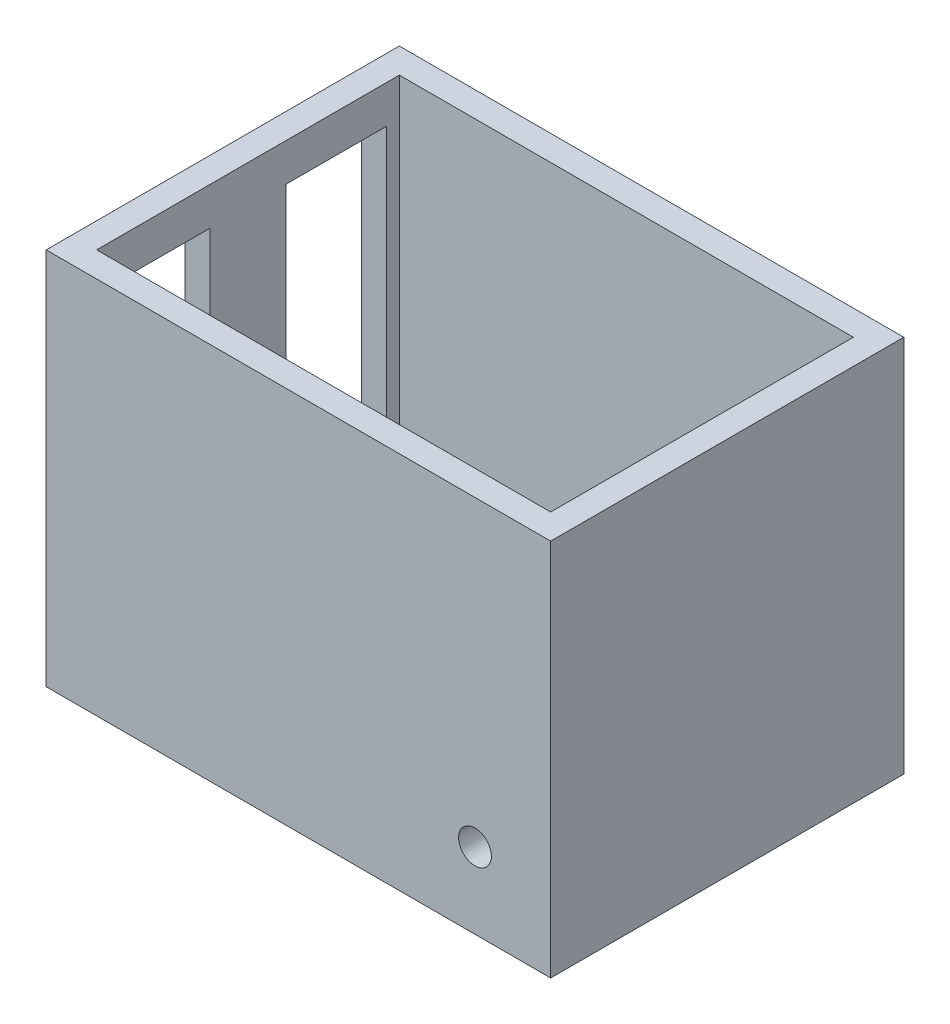
ISO-10303-21;
HEADER;
FILE_DESCRIPTION(('STEP AP214'),'2;1');
FILE_NAME('part.step','',(''),(''),'','','');
FILE_SCHEMA(('AUTOMOTIVE_DESIGN { 1 0 10303 214 1 1 1 1 }'));
ENDSEC;
DATA;
#1=APPLICATION_CONTEXT('core data for automotive mechanical design processes');
#2=APPLICATION_PROTOCOL_DEFINITION('international standard','automotive_design',2000,#1);
#3=PRODUCT_CONTEXT('',#1,'mechanical');
#4=PRODUCT('Part','Part','',(#3));
#5=PRODUCT_RELATED_PRODUCT_CATEGORY('part','',(#4));
#6=PRODUCT_DEFINITION_FORMATION('','',#4);
#7=PRODUCT_DEFINITION_CONTEXT('part definition',#1,'design');
#8=PRODUCT_DEFINITION('design','',#6,#7);
#9=PRODUCT_DEFINITION_SHAPE('','',#8);
#10=(LENGTH_UNIT() NAMED_UNIT(*) SI_UNIT(.MILLI.,.METRE.));
#11=(NAMED_UNIT(*) PLANE_ANGLE_UNIT() SI_UNIT($,.RADIAN.));
#12=(NAMED_UNIT(*) SI_UNIT($,.STERADIAN.) SOLID_ANGLE_UNIT());
#13=UNCERTAINTY_MEASURE_WITH_UNIT(LENGTH_MEASURE(1.E-05),#10,'distance_accuracy_value','');
#14=(GEOMETRIC_REPRESENTATION_CONTEXT(3) GLOBAL_UNCERTAINTY_ASSIGNED_CONTEXT((#13)) GLOBAL_UNIT_ASSIGNED_CONTEXT((#10,
#11,#12)) REPRESENTATION_CONTEXT('',''));
#15=CARTESIAN_POINT('',(0.,0.,0.));
#16=DIRECTION('',(0.,0.,1.));
#17=DIRECTION('',(1.,0.,0.));
#18=AXIS2_PLACEMENT_3D('',#15,#16,#17);
#19=CARTESIAN_POINT('',(-44.7075141862719,76.2,-29.2129134118241));
#20=DIRECTION('',(1.,0.,0.));
#21=DIRECTION('',(0.,0.,-1.));
#22=AXIS2_PLACEMENT_3D('',#19,#20,#21);
#23=PLANE('',#22);
#24=DIRECTION('',(0.,0.,1.));
#25=VECTOR('',#24,1.);
#26=CARTESIAN_POINT('',(-44.7075141862719,7.62,13.9670865881758));
#27=LINE('',#26,#25);
#28=CARTESIAN_POINT('',(-44.7075141862719,7.62000000000002,13.9670865881758));
#29=VERTEX_POINT('',#28);
#30=CARTESIAN_POINT('',(-44.7075141862719,7.62,34.2870865881758));
#31=VERTEX_POINT('',#30);
#32=EDGE_CURVE('E157',#29,#31,#27,.T.);
#33=ORIENTED_EDGE('',*,*,#32,.F.);
#34=DIRECTION('',(0.,-1.,0.));
#35=VECTOR('',#34,1.);
#36=CARTESIAN_POINT('',(-44.7075141862719,68.58,13.9670865881758));
#37=LINE('',#36,#35);
#38=CARTESIAN_POINT('',(-44.7075141862719,68.58,13.9670865881758));
#39=VERTEX_POINT('',#38);
#40=EDGE_CURVE('E47',#39,#29,#37,.T.);
#41=ORIENTED_EDGE('',*,*,#40,.F.);
#42=DIRECTION('',(0.,0.,-1.));
#43=VECTOR('',#42,1.);
#44=CARTESIAN_POINT('',(-44.7075141862719,68.58,13.9670865881758));
#45=LINE('',#44,#43);
#46=CARTESIAN_POINT('',(-44.7075141862719,68.58,34.2870865881758));
#47=VERTEX_POINT('',#46);
#48=EDGE_CURVE('E163',#47,#39,#45,.T.);
#49=ORIENTED_EDGE('',*,*,#48,.F.);
#50=DIRECTION('',(0.,1.,0.));
#51=VECTOR('',#50,1.);
#52=CARTESIAN_POINT('',(-44.7075141862719,68.58,34.2870865881758));
#53=LINE('',#52,#51);
#54=EDGE_CURVE('E148',#31,#47,#53,.T.);
#55=ORIENTED_EDGE('',*,*,#54,.F.);
#56=EDGE_LOOP('',(#33,#41,#49,#55));
#57=FACE_BOUND('',#56,.T.);
#58=DIRECTION('',(0.,0.,1.));
#59=VECTOR('',#58,1.);
#60=CARTESIAN_POINT('',(-44.7075141862719,7.62,-21.5929134118241));
#61=LINE('',#60,#59);
#62=CARTESIAN_POINT('',(-44.7075141862719,7.62000000000002,-21.5929134118241));
#63=VERTEX_POINT('',#62);
#64=CARTESIAN_POINT('',(-44.7075141862719,7.62,-1.27291341182414));
#65=VERTEX_POINT('',#64);
#66=EDGE_CURVE('E174',#63,#65,#61,.T.);
#67=ORIENTED_EDGE('',*,*,#66,.F.);
#68=DIRECTION('',(0.,-1.,0.));
#69=VECTOR('',#68,1.);
#70=CARTESIAN_POINT('',(-44.7075141862719,68.58,-21.5929134118241));
#71=LINE('',#70,#69);
#72=CARTESIAN_POINT('',(-44.7075141862719,68.58,-21.5929134118241));
#73=VERTEX_POINT('',#72);
#74=EDGE_CURVE('E170',#73,#63,#71,.T.);
#75=ORIENTED_EDGE('',*,*,#74,.F.);
#76=DIRECTION('',(0.,0.,-1.));
#77=VECTOR('',#76,1.);
#78=CARTESIAN_POINT('',(-44.7075141862719,68.58,-21.5929134118241));
#79=LINE('',#78,#77);
#80=CARTESIAN_POINT('',(-44.7075141862719,68.58,-1.27291341182415));
#81=VERTEX_POINT('',#80);
#82=EDGE_CURVE('E180',#81,#73,#79,.T.);
#83=ORIENTED_EDGE('',*,*,#82,.F.);
#84=DIRECTION('',(0.,1.,0.));
#85=VECTOR('',#84,1.);
#86=CARTESIAN_POINT('',(-44.7075141862719,68.58,-1.27291341182415));
#87=LINE('',#86,#85);
#88=EDGE_CURVE('E177',#65,#81,#87,.T.);
#89=ORIENTED_EDGE('',*,*,#88,.F.);
#90=EDGE_LOOP('',(#67,#75,#83,#89));
#91=FACE_BOUND('',#90,.T.);
#92=DIRECTION('',(0.,0.,1.));
#93=VECTOR('',#92,1.);
#94=CARTESIAN_POINT('',(-44.7075141862719,0.,-29.2129134118241));
#95=LINE('',#94,#93);
#96=CARTESIAN_POINT('',(-44.7075141862719,0.,-29.2129134118241));
#97=VERTEX_POINT('',#96);
#98=CARTESIAN_POINT('',(-44.7075141862719,0.,41.9070865881758));
#99=VERTEX_POINT('',#98);
#100=EDGE_CURVE('E232',#97,#99,#95,.T.);
#101=ORIENTED_EDGE('',*,*,#100,.T.);
#102=DIRECTION('',(0.,-1.,0.));
#103=VECTOR('',#102,1.);
#104=CARTESIAN_POINT('',(-44.7075141862719,76.2,41.9070865881758));
#105=LINE('',#104,#103);
#106=CARTESIAN_POINT('',(-44.7075141862719,76.2,41.9070865881758));
#107=VERTEX_POINT('',#106);
#108=EDGE_CURVE('E265',#107,#99,#105,.T.);
#109=ORIENTED_EDGE('',*,*,#108,.F.);
#110=DIRECTION('',(0.,0.,1.));
#111=VECTOR('',#110,1.);
#112=CARTESIAN_POINT('',(-44.7075141862719,76.2,-29.2129134118241));
#113=LINE('',#112,#111);
#114=CARTESIAN_POINT('',(-44.7075141862719,76.2,-29.2129134118241));
#115=VERTEX_POINT('',#114);
#116=EDGE_CURVE('E239',#115,#107,#113,.T.);
#117=ORIENTED_EDGE('',*,*,#116,.F.);
#118=DIRECTION('',(0.,-1.,0.));
#119=VECTOR('',#118,1.);
#120=CARTESIAN_POINT('',(-44.7075141862719,76.2,-29.2129134118241));
#121=LINE('',#120,#119);
#122=EDGE_CURVE('E249',#115,#97,#121,.T.);
#123=ORIENTED_EDGE('',*,*,#122,.T.);
#124=EDGE_LOOP('',(#101,#109,#117,#123));
#125=FACE_BOUND('',#124,.T.);
#126=ADVANCED_FACE('F33',(#57,#91,#125),#23,.F.);
#127=CARTESIAN_POINT('',(-44.7075141862719,76.2,41.9070865881758));
#128=DIRECTION('',(0.,0.,-1.));
#129=DIRECTION('',(-1.,0.,0.));
#130=AXIS2_PLACEMENT_3D('',#127,#128,#129);
#131=PLANE('',#130);
#132=CARTESIAN_POINT('',(41.6524858137281,15.24,41.9070865881758));
#133=DIRECTION('',(0.,0.,1.));
#134=DIRECTION('',(1.,0.,0.));
#135=AXIS2_PLACEMENT_3D('',#132,#133,#134);
#136=CIRCLE('',#135,3.302);
#137=CARTESIAN_POINT('',(44.9544858137281,15.24,41.9070865881758));
#138=VERTEX_POINT('',#137);
#139=EDGE_CURVE('E204',#138,#138,#136,.T.);
#140=ORIENTED_EDGE('',*,*,#139,.F.);
#141=EDGE_LOOP('',(#140));
#142=FACE_BOUND('',#141,.T.);
#143=DIRECTION('',(1.,0.,0.));
#144=VECTOR('',#143,1.);
#145=CARTESIAN_POINT('',(-44.7075141862719,0.,41.9070865881758));
#146=LINE('',#145,#144);
#147=CARTESIAN_POINT('',(56.8924858137281,0.,41.9070865881758));
#148=VERTEX_POINT('',#147);
#149=EDGE_CURVE('E252',#99,#148,#146,.T.);
#150=ORIENTED_EDGE('',*,*,#149,.T.);
#151=DIRECTION('',(0.,-1.,0.));
#152=VECTOR('',#151,1.);
#153=CARTESIAN_POINT('',(56.8924858137281,76.2,41.9070865881758));
#154=LINE('',#153,#152);
#155=CARTESIAN_POINT('',(56.8924858137281,76.2,41.9070865881758));
#156=VERTEX_POINT('',#155);
#157=EDGE_CURVE('E262',#156,#148,#154,.T.);
#158=ORIENTED_EDGE('',*,*,#157,.F.);
#159=DIRECTION('',(1.,0.,0.));
#160=VECTOR('',#159,1.);
#161=CARTESIAN_POINT('',(-44.7075141862719,76.2,41.9070865881758));
#162=LINE('',#161,#160);
#163=EDGE_CURVE('E242',#107,#156,#162,.T.);
#164=ORIENTED_EDGE('',*,*,#163,.F.);
#165=ORIENTED_EDGE('',*,*,#108,.T.);
#166=EDGE_LOOP('',(#150,#158,#164,#165));
#167=FACE_BOUND('',#166,.T.);
#168=ADVANCED_FACE('F306',(#142,#167),#131,.F.);
#169=CARTESIAN_POINT('',(56.8924858137281,76.2,-29.2129134118241));
#170=DIRECTION('',(-1.,0.,0.));
#171=DIRECTION('',(0.,0.,1.));
#172=AXIS2_PLACEMENT_3D('',#169,#170,#171);
#173=PLANE('',#172);
#174=DIRECTION('',(0.,0.,-1.));
#175=VECTOR('',#174,1.);
#176=CARTESIAN_POINT('',(56.8924858137281,0.,-29.2129134118241));
#177=LINE('',#176,#175);
#178=CARTESIAN_POINT('',(56.8924858137281,0.,-29.2129134118241));
#179=VERTEX_POINT('',#178);
#180=EDGE_CURVE('E254',#148,#179,#177,.T.);
#181=ORIENTED_EDGE('',*,*,#180,.T.);
#182=DIRECTION('',(0.,-1.,0.));
#183=VECTOR('',#182,1.);
#184=CARTESIAN_POINT('',(56.8924858137281,76.2,-29.2129134118241));
#185=LINE('',#184,#183);
#186=CARTESIAN_POINT('',(56.8924858137281,76.2,-29.2129134118241));
#187=VERTEX_POINT('',#186);
#188=EDGE_CURVE('E259',#187,#179,#185,.T.);
#189=ORIENTED_EDGE('',*,*,#188,.F.);
#190=DIRECTION('',(0.,0.,-1.));
#191=VECTOR('',#190,1.);
#192=CARTESIAN_POINT('',(56.8924858137281,76.2,-29.2129134118241));
#193=LINE('',#192,#191);
#194=EDGE_CURVE('E245',#156,#187,#193,.T.);
#195=ORIENTED_EDGE('',*,*,#194,.F.);
#196=ORIENTED_EDGE('',*,*,#157,.T.);
#197=EDGE_LOOP('',(#181,#189,#195,#196));
#198=FACE_BOUND('',#197,.T.);
#199=ADVANCED_FACE('F310',(#198),#173,.F.);
#200=CARTESIAN_POINT('',(-44.7075141862719,76.2,-29.2129134118241));
#201=DIRECTION('',(0.,0.,1.));
#202=DIRECTION('',(1.,0.,0.));
#203=AXIS2_PLACEMENT_3D('',#200,#201,#202);
#204=PLANE('',#203);
#205=DIRECTION('',(-1.,0.,0.));
#206=VECTOR('',#205,1.);
#207=CARTESIAN_POINT('',(-44.7075141862719,0.,-29.2129134118241));
#208=LINE('',#207,#206);
#209=EDGE_CURVE('E243',#179,#97,#208,.T.);
#210=ORIENTED_EDGE('',*,*,#209,.T.);
#211=ORIENTED_EDGE('',*,*,#122,.F.);
#212=DIRECTION('',(-1.,0.,0.));
#213=VECTOR('',#212,1.);
#214=CARTESIAN_POINT('',(-44.7075141862719,76.2,-29.2129134118241));
#215=LINE('',#214,#213);
#216=EDGE_CURVE('E247',#187,#115,#215,.T.);
#217=ORIENTED_EDGE('',*,*,#216,.F.);
#218=ORIENTED_EDGE('',*,*,#188,.T.);
#219=EDGE_LOOP('',(#210,#211,#217,#218));
#220=FACE_BOUND('',#219,.T.);
#221=ADVANCED_FACE('F315',(#220),#204,.F.);
#222=CARTESIAN_POINT('',(0.,76.2,0.));
#223=DIRECTION('',(0.,1.,0.));
#224=DIRECTION('',(0.,0.,1.));
#225=AXIS2_PLACEMENT_3D('',#222,#223,#224);
#226=PLANE('',#225);
#227=DIRECTION('',(0.,0.,1.));
#228=VECTOR('',#227,1.);
#229=CARTESIAN_POINT('',(-39.6275141862719,76.2,-24.1329134118241));
#230=LINE('',#229,#228);
#231=CARTESIAN_POINT('',(-39.6275141862719,76.2,-24.1329134118241));
#232=VERTEX_POINT('',#231);
#233=CARTESIAN_POINT('',(-39.6275141862719,76.2,36.8270865881758));
#234=VERTEX_POINT('',#233);
#235=EDGE_CURVE('E220',#232,#234,#230,.T.);
#236=ORIENTED_EDGE('',*,*,#235,.F.);
#237=DIRECTION('',(1.,0.,0.));
#238=VECTOR('',#237,1.);
#239=CARTESIAN_POINT('',(-39.6275141862719,76.2,-24.1329134118241));
#240=LINE('',#239,#238);
#241=CARTESIAN_POINT('',(51.8124858137281,76.2,-24.1329134118241));
#242=VERTEX_POINT('',#241);
#243=EDGE_CURVE('E212',#232,#242,#240,.T.);
#244=ORIENTED_EDGE('',*,*,#243,.T.);
#245=DIRECTION('',(0.,0.,1.));
#246=VECTOR('',#245,1.);
#247=CARTESIAN_POINT('',(51.8124858137281,76.2,-24.1329134118241));
#248=LINE('',#247,#246);
#249=CARTESIAN_POINT('',(51.8124858137281,76.2,36.8270865881758));
#250=VERTEX_POINT('',#249);
#251=EDGE_CURVE('E225',#242,#250,#248,.T.);
#252=ORIENTED_EDGE('',*,*,#251,.T.);
#253=DIRECTION('',(1.,0.,0.));
#254=VECTOR('',#253,1.);
#255=CARTESIAN_POINT('',(-39.6275141862719,76.2,36.8270865881758));
#256=LINE('',#255,#254);
#257=EDGE_CURVE('E222',#234,#250,#256,.T.);
#258=ORIENTED_EDGE('',*,*,#257,.F.);
#259=EDGE_LOOP('',(#236,#244,#252,#258));
#260=FACE_BOUND('',#259,.T.);
#261=ORIENTED_EDGE('',*,*,#116,.T.);
#262=ORIENTED_EDGE('',*,*,#163,.T.);
#263=ORIENTED_EDGE('',*,*,#194,.T.);
#264=ORIENTED_EDGE('',*,*,#216,.T.);
#265=EDGE_LOOP('',(#261,#262,#263,#264));
#266=FACE_BOUND('',#265,.T.);
#267=ADVANCED_FACE('F323',(#260,#266),#226,.T.);
#268=CARTESIAN_POINT('',(0.,0.,0.));
#269=DIRECTION('',(0.,1.,0.));
#270=DIRECTION('',(0.,0.,1.));
#271=AXIS2_PLACEMENT_3D('',#268,#269,#270);
#272=PLANE('',#271);
#273=CARTESIAN_POINT('',(25.1424858137281,0.,6.34708658817585));
#274=DIRECTION('',(0.,1.,0.));
#275=DIRECTION('',(0.,0.,1.));
#276=AXIS2_PLACEMENT_3D('',#273,#274,#275);
#277=CIRCLE('',#276,5.08);
#278=CARTESIAN_POINT('',(25.1424858137281,0.,11.4270865881758));
#279=VERTEX_POINT('',#278);
#280=EDGE_CURVE('E195',#279,#279,#277,.T.);
#281=ORIENTED_EDGE('',*,*,#280,.T.);
#282=EDGE_LOOP('',(#281));
#283=FACE_BOUND('',#282,.T.);
#284=CARTESIAN_POINT('',(-12.9575141862719,0.,3.80708658817584));
#285=DIRECTION('',(0.,1.,0.));
#286=DIRECTION('',(0.,0.,1.));
#287=AXIS2_PLACEMENT_3D('',#284,#285,#286);
#288=CIRCLE('',#287,5.08);
#289=CARTESIAN_POINT('',(-12.9575141862719,0.,8.88708658817584));
#290=VERTEX_POINT('',#289);
#291=EDGE_CURVE('E201',#290,#290,#288,.T.);
#292=ORIENTED_EDGE('',*,*,#291,.T.);
#293=EDGE_LOOP('',(#292));
#294=FACE_BOUND('',#293,.T.);
#295=ORIENTED_EDGE('',*,*,#100,.F.);
#296=ORIENTED_EDGE('',*,*,#209,.F.);
#297=ORIENTED_EDGE('',*,*,#180,.F.);
#298=ORIENTED_EDGE('',*,*,#149,.F.);
#299=EDGE_LOOP('',(#295,#296,#297,#298));
#300=FACE_BOUND('',#299,.T.);
#301=ADVANCED_FACE('F325',(#283,#294,#300),#272,.F.);
#302=CARTESIAN_POINT('',(-39.6275141862719,5.08000000000002,-24.1329134118241));
#303=DIRECTION('',(-1.,0.,0.));
#304=DIRECTION('',(0.,0.,1.));
#305=AXIS2_PLACEMENT_3D('',#302,#303,#304);
#306=PLANE('',#305);
#307=DIRECTION('',(0.,0.,-1.));
#308=VECTOR('',#307,1.);
#309=CARTESIAN_POINT('',(-39.6275141862719,68.58,-24.1329134118241));
#310=LINE('',#309,#308);
#311=CARTESIAN_POINT('',(-39.6275141862719,68.58,34.2870865881758));
#312=VERTEX_POINT('',#311);
#313=CARTESIAN_POINT('',(-39.6275141862719,68.58,13.9670865881758));
#314=VERTEX_POINT('',#313);
#315=EDGE_CURVE('E40',#312,#314,#310,.T.);
#316=ORIENTED_EDGE('',*,*,#315,.T.);
#317=DIRECTION('',(0.,-1.,0.));
#318=VECTOR('',#317,1.);
#319=CARTESIAN_POINT('',(-39.6275141862719,5.08000000000002,13.9670865881758));
#320=LINE('',#319,#318);
#321=CARTESIAN_POINT('',(-39.6275141862719,7.62,13.9670865881758));
#322=VERTEX_POINT('',#321);
#323=EDGE_CURVE('E11',#314,#322,#320,.T.);
#324=ORIENTED_EDGE('',*,*,#323,.T.);
#325=DIRECTION('',(0.,0.,1.));
#326=VECTOR('',#325,1.);
#327=CARTESIAN_POINT('',(-39.6275141862719,7.62,-24.1329134118241));
#328=LINE('',#327,#326);
#329=CARTESIAN_POINT('',(-39.6275141862719,7.62,34.2870865881758));
#330=VERTEX_POINT('',#329);
#331=EDGE_CURVE('E282',#322,#330,#328,.T.);
#332=ORIENTED_EDGE('',*,*,#331,.T.);
#333=DIRECTION('',(0.,1.,0.));
#334=VECTOR('',#333,1.);
#335=CARTESIAN_POINT('',(-39.6275141862719,5.08000000000002,34.2870865881758));
#336=LINE('',#335,#334);
#337=EDGE_CURVE('E151',#330,#312,#336,.T.);
#338=ORIENTED_EDGE('',*,*,#337,.T.);
#339=EDGE_LOOP('',(#316,#324,#332,#338));
#340=FACE_BOUND('',#339,.T.);
#341=DIRECTION('',(0.,0.,-1.));
#342=VECTOR('',#341,1.);
#343=CARTESIAN_POINT('',(-39.6275141862719,68.58,-24.1329134118241));
#344=LINE('',#343,#342);
#345=CARTESIAN_POINT('',(-39.6275141862719,68.58,-1.27291341182415));
#346=VERTEX_POINT('',#345);
#347=CARTESIAN_POINT('',(-39.6275141862719,68.58,-21.5929134118241));
#348=VERTEX_POINT('',#347);
#349=EDGE_CURVE('E276',#346,#348,#344,.T.);
#350=ORIENTED_EDGE('',*,*,#349,.T.);
#351=DIRECTION('',(0.,-1.,0.));
#352=VECTOR('',#351,1.);
#353=CARTESIAN_POINT('',(-39.6275141862719,5.08000000000002,-21.5929134118241));
#354=LINE('',#353,#352);
#355=CARTESIAN_POINT('',(-39.6275141862719,7.62,-21.5929134118241));
#356=VERTEX_POINT('',#355);
#357=EDGE_CURVE('E279',#348,#356,#354,.T.);
#358=ORIENTED_EDGE('',*,*,#357,.T.);
#359=DIRECTION('',(0.,0.,1.));
#360=VECTOR('',#359,1.);
#361=CARTESIAN_POINT('',(-39.6275141862719,7.62,-24.1329134118241));
#362=LINE('',#361,#360);
#363=CARTESIAN_POINT('',(-39.6275141862719,7.62,-1.27291341182414));
#364=VERTEX_POINT('',#363);
#365=EDGE_CURVE('E268',#356,#364,#362,.T.);
#366=ORIENTED_EDGE('',*,*,#365,.T.);
#367=DIRECTION('',(0.,1.,0.));
#368=VECTOR('',#367,1.);
#369=CARTESIAN_POINT('',(-39.6275141862719,5.08000000000002,-1.27291341182414));
#370=LINE('',#369,#368);
#371=EDGE_CURVE('E273',#364,#346,#370,.T.);
#372=ORIENTED_EDGE('',*,*,#371,.T.);
#373=EDGE_LOOP('',(#350,#358,#366,#372));
#374=FACE_BOUND('',#373,.T.);
#375=ORIENTED_EDGE('',*,*,#235,.T.);
#376=DIRECTION('',(0.,1.,0.));
#377=VECTOR('',#376,1.);
#378=CARTESIAN_POINT('',(-39.6275141862719,5.08000000000002,36.8270865881758));
#379=LINE('',#378,#377);
#380=CARTESIAN_POINT('',(-39.6275141862719,5.08000000000002,36.8270865881758));
#381=VERTEX_POINT('',#380);
#382=EDGE_CURVE('E219',#381,#234,#379,.T.);
#383=ORIENTED_EDGE('',*,*,#382,.F.);
#384=DIRECTION('',(0.,0.,1.));
#385=VECTOR('',#384,1.);
#386=CARTESIAN_POINT('',(-39.6275141862719,5.08000000000002,-24.1329134118241));
#387=LINE('',#386,#385);
#388=CARTESIAN_POINT('',(-39.6275141862719,5.08000000000002,-24.1329134118241));
#389=VERTEX_POINT('',#388);
#390=EDGE_CURVE('E208',#389,#381,#387,.T.);
#391=ORIENTED_EDGE('',*,*,#390,.F.);
#392=DIRECTION('',(0.,1.,0.));
#393=VECTOR('',#392,1.);
#394=CARTESIAN_POINT('',(-39.6275141862719,5.08000000000002,-24.1329134118241));
#395=LINE('',#394,#393);
#396=EDGE_CURVE('E230',#389,#232,#395,.T.);
#397=ORIENTED_EDGE('',*,*,#396,.T.);
#398=EDGE_LOOP('',(#375,#383,#391,#397));
#399=FACE_BOUND('',#398,.T.);
#400=ADVANCED_FACE('F286',(#340,#374,#399),#306,.F.);
#401=CARTESIAN_POINT('',(-39.6275141862719,5.08000000000002,-24.1329134118241));
#402=DIRECTION('',(0.,0.,1.));
#403=DIRECTION('',(1.,0.,0.));
#404=AXIS2_PLACEMENT_3D('',#401,#402,#403);
#405=PLANE('',#404);
#406=ORIENTED_EDGE('',*,*,#243,.F.);
#407=ORIENTED_EDGE('',*,*,#396,.F.);
#408=DIRECTION('',(1.,0.,0.));
#409=VECTOR('',#408,1.);
#410=CARTESIAN_POINT('',(-39.6275141862719,5.08000000000002,-24.1329134118241));
#411=LINE('',#410,#409);
#412=CARTESIAN_POINT('',(51.8124858137281,5.08000000000002,-24.1329134118241));
#413=VERTEX_POINT('',#412);
#414=EDGE_CURVE('E217',#389,#413,#411,.T.);
#415=ORIENTED_EDGE('',*,*,#414,.T.);
#416=DIRECTION('',(0.,1.,0.));
#417=VECTOR('',#416,1.);
#418=CARTESIAN_POINT('',(51.8124858137281,5.08000000000002,-24.1329134118241));
#419=LINE('',#418,#417);
#420=EDGE_CURVE('E233',#413,#242,#419,.T.);
#421=ORIENTED_EDGE('',*,*,#420,.T.);
#422=EDGE_LOOP('',(#406,#407,#415,#421));
#423=FACE_BOUND('',#422,.T.);
#424=ADVANCED_FACE('F334',(#423),#405,.T.);
#425=CARTESIAN_POINT('',(51.8124858137281,5.08000000000002,-24.1329134118241));
#426=DIRECTION('',(-1.,0.,0.));
#427=DIRECTION('',(0.,0.,1.));
#428=AXIS2_PLACEMENT_3D('',#425,#426,#427);
#429=PLANE('',#428);
#430=ORIENTED_EDGE('',*,*,#251,.F.);
#431=ORIENTED_EDGE('',*,*,#420,.F.);
#432=DIRECTION('',(0.,0.,1.));
#433=VECTOR('',#432,1.);
#434=CARTESIAN_POINT('',(51.8124858137281,5.08000000000002,-24.1329134118241));
#435=LINE('',#434,#433);
#436=CARTESIAN_POINT('',(51.8124858137281,5.08000000000002,36.8270865881758));
#437=VERTEX_POINT('',#436);
#438=EDGE_CURVE('E215',#413,#437,#435,.T.);
#439=ORIENTED_EDGE('',*,*,#438,.T.);
#440=DIRECTION('',(0.,1.,0.));
#441=VECTOR('',#440,1.);
#442=CARTESIAN_POINT('',(51.8124858137281,5.08000000000002,36.8270865881758));
#443=LINE('',#442,#441);
#444=EDGE_CURVE('E235',#437,#250,#443,.T.);
#445=ORIENTED_EDGE('',*,*,#444,.T.);
#446=EDGE_LOOP('',(#430,#431,#439,#445));
#447=FACE_BOUND('',#446,.T.);
#448=ADVANCED_FACE('F339',(#447),#429,.T.);
#449=CARTESIAN_POINT('',(-39.6275141862719,5.08000000000002,36.8270865881758));
#450=DIRECTION('',(0.,0.,1.));
#451=DIRECTION('',(1.,0.,0.));
#452=AXIS2_PLACEMENT_3D('',#449,#450,#451);
#453=PLANE('',#452);
#454=CARTESIAN_POINT('',(41.6524858137281,15.24,36.8270865881758));
#455=DIRECTION('',(0.,0.,1.));
#456=DIRECTION('',(1.,0.,0.));
#457=AXIS2_PLACEMENT_3D('',#454,#455,#456);
#458=CIRCLE('',#457,3.302);
#459=CARTESIAN_POINT('',(44.9544858137281,15.24,36.8270865881758));
#460=VERTEX_POINT('',#459);
#461=EDGE_CURVE('E207',#460,#460,#458,.T.);
#462=ORIENTED_EDGE('',*,*,#461,.T.);
#463=EDGE_LOOP('',(#462));
#464=FACE_BOUND('',#463,.T.);
#465=ORIENTED_EDGE('',*,*,#257,.T.);
#466=ORIENTED_EDGE('',*,*,#444,.F.);
#467=DIRECTION('',(1.,0.,0.));
#468=VECTOR('',#467,1.);
#469=CARTESIAN_POINT('',(-39.6275141862719,5.08000000000002,36.8270865881758));
#470=LINE('',#469,#468);
#471=EDGE_CURVE('E211',#381,#437,#470,.T.);
#472=ORIENTED_EDGE('',*,*,#471,.F.);
#473=ORIENTED_EDGE('',*,*,#382,.T.);
#474=EDGE_LOOP('',(#465,#466,#472,#473));
#475=FACE_BOUND('',#474,.T.);
#476=ADVANCED_FACE('F335',(#464,#475),#453,.F.);
#477=CARTESIAN_POINT('',(0.,5.08000000000002,0.));
#478=DIRECTION('',(0.,1.,0.));
#479=DIRECTION('',(0.,0.,1.));
#480=AXIS2_PLACEMENT_3D('',#477,#478,#479);
#481=PLANE('',#480);
#482=CARTESIAN_POINT('',(25.1424858137281,5.08000000000002,6.34708658817585));
#483=DIRECTION('',(0.,1.,0.));
#484=DIRECTION('',(0.,0.,1.));
#485=AXIS2_PLACEMENT_3D('',#482,#483,#484);
#486=CIRCLE('',#485,5.08);
#487=CARTESIAN_POINT('',(25.1424858137281,5.08000000000002,11.4270865881758));
#488=VERTEX_POINT('',#487);
#489=EDGE_CURVE('E186',#488,#488,#486,.T.);
#490=ORIENTED_EDGE('',*,*,#489,.F.);
#491=EDGE_LOOP('',(#490));
#492=FACE_BOUND('',#491,.T.);
#493=CARTESIAN_POINT('',(-12.9575141862719,5.08000000000002,3.80708658817584));
#494=DIRECTION('',(0.,1.,0.));
#495=DIRECTION('',(0.,0.,1.));
#496=AXIS2_PLACEMENT_3D('',#493,#494,#495);
#497=CIRCLE('',#496,5.08);
#498=CARTESIAN_POINT('',(-12.9575141862719,5.08000000000002,8.88708658817584));
#499=VERTEX_POINT('',#498);
#500=EDGE_CURVE('E198',#499,#499,#497,.T.);
#501=ORIENTED_EDGE('',*,*,#500,.F.);
#502=EDGE_LOOP('',(#501));
#503=FACE_BOUND('',#502,.T.);
#504=ORIENTED_EDGE('',*,*,#390,.T.);
#505=ORIENTED_EDGE('',*,*,#471,.T.);
#506=ORIENTED_EDGE('',*,*,#438,.F.);
#507=ORIENTED_EDGE('',*,*,#414,.F.);
#508=EDGE_LOOP('',(#504,#505,#506,#507));
#509=FACE_BOUND('',#508,.T.);
#510=ADVANCED_FACE('F338',(#492,#503,#509),#481,.T.);
#511=CARTESIAN_POINT('',(41.6524858137281,15.24,34.2870865881758));
#512=DIRECTION('',(0.,0.,1.));
#513=DIRECTION('',(1.,0.,0.));
#514=AXIS2_PLACEMENT_3D('',#511,#512,#513);
#515=CYLINDRICAL_SURFACE('',#514,3.302);
#516=CARTESIAN_POINT('',(44.9544858137281,15.24,41.9070865881758));
#517=CARTESIAN_POINT('',(44.9544858137281,15.24,41.8541699215092));
#518=CARTESIAN_POINT('',(44.9544858137281,15.24,41.8012532548425));
#519=CARTESIAN_POINT('',(44.9544858137281,15.24,41.6954199215092));
#520=CARTESIAN_POINT('',(44.9544858137281,15.24,41.6425032548425));
#521=CARTESIAN_POINT('',(44.9544858137281,15.24,41.5366699215092));
#522=CARTESIAN_POINT('',(44.9544858137281,15.24,41.4837532548425));
#523=CARTESIAN_POINT('',(44.9544858137281,15.24,41.3779199215092));
#524=CARTESIAN_POINT('',(44.9544858137281,15.24,41.3250032548425));
#525=CARTESIAN_POINT('',(44.9544858137281,15.24,41.2191699215092));
#526=CARTESIAN_POINT('',(44.9544858137281,15.24,41.1662532548425));
#527=CARTESIAN_POINT('',(44.9544858137281,15.24,41.0604199215092));
#528=CARTESIAN_POINT('',(44.9544858137281,15.24,41.0075032548425));
#529=CARTESIAN_POINT('',(44.9544858137281,15.24,40.9016699215092));
#530=CARTESIAN_POINT('',(44.9544858137281,15.24,40.8487532548425));
#531=CARTESIAN_POINT('',(44.9544858137281,15.24,40.7429199215092));
#532=CARTESIAN_POINT('',(44.9544858137281,15.24,40.6900032548425));
#533=CARTESIAN_POINT('',(44.9544858137281,15.24,40.5841699215092));
#534=CARTESIAN_POINT('',(44.9544858137281,15.24,40.5312532548425));
#535=CARTESIAN_POINT('',(44.9544858137281,15.24,40.4254199215092));
#536=CARTESIAN_POINT('',(44.9544858137281,15.24,40.3725032548425));
#537=CARTESIAN_POINT('',(44.9544858137281,15.24,40.2666699215092));
#538=CARTESIAN_POINT('',(44.9544858137281,15.24,40.2137532548425));
#539=CARTESIAN_POINT('',(44.9544858137281,15.24,40.1079199215092));
#540=CARTESIAN_POINT('',(44.9544858137281,15.24,40.0550032548425));
#541=CARTESIAN_POINT('',(44.9544858137281,15.24,39.9491699215092));
#542=CARTESIAN_POINT('',(44.9544858137281,15.24,39.8962532548425));
#543=CARTESIAN_POINT('',(44.9544858137281,15.24,39.7904199215092));
#544=CARTESIAN_POINT('',(44.9544858137281,15.24,39.7375032548425));
#545=CARTESIAN_POINT('',(44.9544858137281,15.24,39.6316699215092));
#546=CARTESIAN_POINT('',(44.9544858137281,15.24,39.5787532548425));
#547=CARTESIAN_POINT('',(44.9544858137281,15.24,39.4729199215092));
#548=CARTESIAN_POINT('',(44.9544858137281,15.24,39.4200032548425));
#549=CARTESIAN_POINT('',(44.9544858137281,15.24,39.3141699215092));
#550=CARTESIAN_POINT('',(44.9544858137281,15.24,39.2612532548425));
#551=CARTESIAN_POINT('',(44.9544858137281,15.24,39.1554199215092));
#552=CARTESIAN_POINT('',(44.9544858137281,15.24,39.1025032548425));
#553=CARTESIAN_POINT('',(44.9544858137281,15.24,38.9966699215092));
#554=CARTESIAN_POINT('',(44.9544858137281,15.24,38.9437532548425));
#555=CARTESIAN_POINT('',(44.9544858137281,15.24,38.8379199215092));
#556=CARTESIAN_POINT('',(44.9544858137281,15.24,38.7850032548425));
#557=CARTESIAN_POINT('',(44.9544858137281,15.24,38.6791699215092));
#558=CARTESIAN_POINT('',(44.9544858137281,15.24,38.6262532548425));
#559=CARTESIAN_POINT('',(44.9544858137281,15.24,38.5204199215092));
#560=CARTESIAN_POINT('',(44.9544858137281,15.24,38.4675032548425));
#561=CARTESIAN_POINT('',(44.9544858137281,15.24,38.3616699215092));
#562=CARTESIAN_POINT('',(44.9544858137281,15.24,38.3087532548425));
#563=CARTESIAN_POINT('',(44.9544858137281,15.24,38.2029199215092));
#564=CARTESIAN_POINT('',(44.9544858137281,15.24,38.1500032548425));
#565=CARTESIAN_POINT('',(44.9544858137281,15.24,38.0441699215092));
#566=CARTESIAN_POINT('',(44.9544858137281,15.24,37.9912532548425));
#567=CARTESIAN_POINT('',(44.9544858137281,15.24,37.8854199215092));
#568=CARTESIAN_POINT('',(44.9544858137281,15.24,37.8325032548425));
#569=CARTESIAN_POINT('',(44.9544858137281,15.24,37.7266699215092));
#570=CARTESIAN_POINT('',(44.9544858137281,15.24,37.6737532548425));
#571=CARTESIAN_POINT('',(44.9544858137281,15.24,37.5679199215092));
#572=CARTESIAN_POINT('',(44.9544858137281,15.24,37.5150032548425));
#573=CARTESIAN_POINT('',(44.9544858137281,15.24,37.4091699215092));
#574=CARTESIAN_POINT('',(44.9544858137281,15.24,37.3562532548425));
#575=CARTESIAN_POINT('',(44.9544858137281,15.24,37.2504199215092));
#576=CARTESIAN_POINT('',(44.9544858137281,15.24,37.1975032548425));
#577=CARTESIAN_POINT('',(44.9544858137281,15.24,37.0916699215092));
#578=CARTESIAN_POINT('',(44.9544858137281,15.24,37.0387532548425));
#579=CARTESIAN_POINT('',(44.9544858137281,15.24,36.9329199215092));
#580=CARTESIAN_POINT('',(44.9544858137281,15.24,36.8800032548425));
#581=CARTESIAN_POINT('',(44.9544858137281,15.24,36.8270865881758));
#582=B_SPLINE_CURVE_WITH_KNOTS('',3,(#516,#517,#518,#519,#520,#521,#522,#523,#524,#525,#526,
#527,#528,#529,#530,#531,#532,#533,#534,#535,#536,#537,#538,#539,#540,#541,#542,#543,#544,#545,
#546,#547,#548,#549,#550,#551,#552,#553,#554,#555,#556,#557,#558,#559,#560,#561,#562,#563,#564,
#565,#566,#567,#568,#569,#570,#571,#572,#573,#574,#575,#576,#577,#578,#579,#580,#581),
.UNSPECIFIED.,.F.,.F.,(4,2,2,2,2,2,2,2,2,2,2,2,2,2,2,2,2,2,2,2,2,2,2,2,2,2,2,2,2,2,2,2,4),(0.,
0.158750000000006,0.317500000000005,0.476250000000004,0.635000000000004,0.793750000000003,
0.952500000000002,1.11125,1.27,1.42875,1.58750000000001,1.74625,1.905,2.06375,2.2225,2.38125,
2.54,2.69875000000001,2.85750000000001,3.01625000000001,3.175,3.33375,3.4925,3.65125,3.81,
3.96875000000001,4.12750000000001,4.28625000000001,4.445,4.60375,4.7625,4.92125,5.08),.UNSPECIFIED.);
#583=EDGE_CURVE('BSEAM349',#138,#460,#582,.T.);
#584=ORIENTED_EDGE('',*,*,#139,.T.);
#585=ORIENTED_EDGE('',*,*,#461,.F.);
#586=ORIENTED_EDGE('',*,*,#583,.T.);
#587=ORIENTED_EDGE('',*,*,#583,.F.);
#588=EDGE_LOOP('',(#584,#586,#585,#587));
#589=FACE_BOUND('',#588,.T.);
#590=ADVANCED_FACE('F349',(#589),#515,.F.);
#591=CARTESIAN_POINT('',(-12.9575141862719,-2.53999999999998,3.80708658817584));
#592=DIRECTION('',(0.,1.,0.));
#593=DIRECTION('',(0.,0.,1.));
#594=AXIS2_PLACEMENT_3D('',#591,#592,#593);
#595=CYLINDRICAL_SURFACE('',#594,5.08);
#596=CARTESIAN_POINT('',(-12.9575141862719,5.08000000000002,8.88708658817584));
#597=CARTESIAN_POINT('',(-12.9575141862719,5.02708333333335,8.88708658817584));
#598=CARTESIAN_POINT('',(-12.9575141862719,4.97416666666668,8.88708658817584));
#599=CARTESIAN_POINT('',(-12.9575141862719,4.86833333333335,8.88708658817584));
#600=CARTESIAN_POINT('',(-12.9575141862719,4.81541666666668,8.88708658817584));
#601=CARTESIAN_POINT('',(-12.9575141862719,4.70958333333335,8.88708658817584));
#602=CARTESIAN_POINT('',(-12.9575141862719,4.65666666666668,8.88708658817584));
#603=CARTESIAN_POINT('',(-12.9575141862719,4.55083333333335,8.88708658817584));
#604=CARTESIAN_POINT('',(-12.9575141862719,4.49791666666668,8.88708658817584));
#605=CARTESIAN_POINT('',(-12.9575141862719,4.39208333333335,8.88708658817584));
#606=CARTESIAN_POINT('',(-12.9575141862719,4.33916666666668,8.88708658817584));
#607=CARTESIAN_POINT('',(-12.9575141862719,4.23333333333335,8.88708658817584));
#608=CARTESIAN_POINT('',(-12.9575141862719,4.18041666666668,8.88708658817584));
#609=CARTESIAN_POINT('',(-12.9575141862719,4.07458333333334,8.88708658817584));
#610=CARTESIAN_POINT('',(-12.9575141862719,4.02166666666668,8.88708658817584));
#611=CARTESIAN_POINT('',(-12.9575141862719,3.91583333333335,8.88708658817584));
#612=CARTESIAN_POINT('',(-12.9575141862719,3.86291666666668,8.88708658817584));
#613=CARTESIAN_POINT('',(-12.9575141862719,3.75708333333334,8.88708658817584));
#614=CARTESIAN_POINT('',(-12.9575141862719,3.70416666666668,8.88708658817584));
#615=CARTESIAN_POINT('',(-12.9575141862719,3.59833333333334,8.88708658817584));
#616=CARTESIAN_POINT('',(-12.9575141862719,3.54541666666668,8.88708658817584));
#617=CARTESIAN_POINT('',(-12.9575141862719,3.43958333333334,8.88708658817584));
#618=CARTESIAN_POINT('',(-12.9575141862719,3.38666666666668,8.88708658817584));
#619=CARTESIAN_POINT('',(-12.9575141862719,3.28083333333334,8.88708658817584));
#620=CARTESIAN_POINT('',(-12.9575141862719,3.22791666666668,8.88708658817584));
#621=CARTESIAN_POINT('',(-12.9575141862719,3.12208333333334,8.88708658817584));
#622=CARTESIAN_POINT('',(-12.9575141862719,3.06916666666668,8.88708658817584));
#623=CARTESIAN_POINT('',(-12.9575141862719,2.96333333333334,8.88708658817584));
#624=CARTESIAN_POINT('',(-12.9575141862719,2.91041666666667,8.88708658817584));
#625=CARTESIAN_POINT('',(-12.9575141862719,2.80458333333334,8.88708658817584));
#626=CARTESIAN_POINT('',(-12.9575141862719,2.75166666666667,8.88708658817584));
#627=CARTESIAN_POINT('',(-12.9575141862719,2.64583333333334,8.88708658817584));
#628=CARTESIAN_POINT('',(-12.9575141862719,2.59291666666667,8.88708658817584));
#629=CARTESIAN_POINT('',(-12.9575141862719,2.48708333333334,8.88708658817584));
#630=CARTESIAN_POINT('',(-12.9575141862719,2.43416666666667,8.88708658817584));
#631=CARTESIAN_POINT('',(-12.9575141862719,2.32833333333334,8.88708658817584));
#632=CARTESIAN_POINT('',(-12.9575141862719,2.27541666666667,8.88708658817584));
#633=CARTESIAN_POINT('',(-12.9575141862719,2.16958333333334,8.88708658817584));
#634=CARTESIAN_POINT('',(-12.9575141862719,2.11666666666667,8.88708658817584));
#635=CARTESIAN_POINT('',(-12.9575141862719,2.01083333333334,8.88708658817584));
#636=CARTESIAN_POINT('',(-12.9575141862719,1.95791666666667,8.88708658817584));
#637=CARTESIAN_POINT('',(-12.9575141862719,1.85208333333334,8.88708658817584));
#638=CARTESIAN_POINT('',(-12.9575141862719,1.79916666666667,8.88708658817584));
#639=CARTESIAN_POINT('',(-12.9575141862719,1.69333333333334,8.88708658817584));
#640=CARTESIAN_POINT('',(-12.9575141862719,1.64041666666667,8.88708658817584));
#641=CARTESIAN_POINT('',(-12.9575141862719,1.53458333333334,8.88708658817584));
#642=CARTESIAN_POINT('',(-12.9575141862719,1.48166666666667,8.88708658817584));
#643=CARTESIAN_POINT('',(-12.9575141862719,1.37583333333334,8.88708658817584));
#644=CARTESIAN_POINT('',(-12.9575141862719,1.32291666666667,8.88708658817584));
#645=CARTESIAN_POINT('',(-12.9575141862719,1.21708333333334,8.88708658817584));
#646=CARTESIAN_POINT('',(-12.9575141862719,1.16416666666667,8.88708658817584));
#647=CARTESIAN_POINT('',(-12.9575141862719,1.05833333333334,8.88708658817584));
#648=CARTESIAN_POINT('',(-12.9575141862719,1.00541666666667,8.88708658817584));
#649=CARTESIAN_POINT('',(-12.9575141862719,0.899583333333336,8.88708658817584));
#650=CARTESIAN_POINT('',(-12.9575141862719,0.846666666666669,8.88708658817584));
#651=CARTESIAN_POINT('',(-12.9575141862719,0.740833333333335,8.88708658817584));
#652=CARTESIAN_POINT('',(-12.9575141862719,0.687916666666668,8.88708658817584));
#653=CARTESIAN_POINT('',(-12.9575141862719,0.582083333333335,8.88708658817584));
#654=CARTESIAN_POINT('',(-12.9575141862719,0.529166666666668,8.88708658817584));
#655=CARTESIAN_POINT('',(-12.9575141862719,0.423333333333334,8.88708658817584));
#656=CARTESIAN_POINT('',(-12.9575141862719,0.370416666666668,8.88708658817584));
#657=CARTESIAN_POINT('',(-12.9575141862719,0.264583333333334,8.88708658817584));
#658=CARTESIAN_POINT('',(-12.9575141862719,0.211666666666667,8.88708658817584));
#659=CARTESIAN_POINT('',(-12.9575141862719,0.105833333333333,8.88708658817584));
#660=CARTESIAN_POINT('',(-12.9575141862719,0.0529166666666665,8.88708658817584));
#661=CARTESIAN_POINT('',(-12.9575141862719,0.,8.88708658817584));
#662=B_SPLINE_CURVE_WITH_KNOTS('',3,(#596,#597,#598,#599,#600,#601,#602,#603,#604,#605,#606,
#607,#608,#609,#610,#611,#612,#613,#614,#615,#616,#617,#618,#619,#620,#621,#622,#623,#624,#625,
#626,#627,#628,#629,#630,#631,#632,#633,#634,#635,#636,#637,#638,#639,#640,#641,#642,#643,#644,
#645,#646,#647,#648,#649,#650,#651,#652,#653,#654,#655,#656,#657,#658,#659,#660,#661),
.UNSPECIFIED.,.F.,.F.,(4,2,2,2,2,2,2,2,2,2,2,2,2,2,2,2,2,2,2,2,2,2,2,2,2,2,2,2,2,2,2,2,4),(0.,
0.158750000000001,0.317500000000001,0.476250000000002,0.635000000000002,0.793750000000003,
0.952500000000003,1.11125,1.27,1.42875,1.5875,1.74625000000001,1.90500000000001,
2.06375000000001,2.22250000000001,2.38125000000001,2.54000000000001,2.69875000000001,
2.85750000000001,3.01625000000001,3.17500000000001,3.33375000000001,3.49250000000001,
3.65125000000001,3.81000000000001,3.96875000000001,4.12750000000001,4.28625000000001,
4.44500000000001,4.60375000000001,4.76250000000002,4.92125000000001,5.08000000000002),.UNSPECIFIED.);
#663=EDGE_CURVE('BSEAM353',#499,#290,#662,.T.);
#664=ORIENTED_EDGE('',*,*,#500,.T.);
#665=ORIENTED_EDGE('',*,*,#291,.F.);
#666=ORIENTED_EDGE('',*,*,#663,.T.);
#667=ORIENTED_EDGE('',*,*,#663,.F.);
#668=EDGE_LOOP('',(#664,#666,#665,#667));
#669=FACE_BOUND('',#668,.T.);
#670=ADVANCED_FACE('F353',(#669),#595,.F.);
#671=CARTESIAN_POINT('',(25.1424858137281,-2.53999999999998,6.34708658817585));
#672=DIRECTION('',(0.,1.,0.));
#673=DIRECTION('',(0.,0.,1.));
#674=AXIS2_PLACEMENT_3D('',#671,#672,#673);
#675=CYLINDRICAL_SURFACE('',#674,5.08);
#676=CARTESIAN_POINT('',(25.1424858137281,5.08000000000002,11.4270865881758));
#677=CARTESIAN_POINT('',(25.1424858137281,5.02708333333335,11.4270865881758));
#678=CARTESIAN_POINT('',(25.1424858137281,4.97416666666668,11.4270865881758));
#679=CARTESIAN_POINT('',(25.1424858137281,4.86833333333335,11.4270865881758));
#680=CARTESIAN_POINT('',(25.1424858137281,4.81541666666668,11.4270865881758));
#681=CARTESIAN_POINT('',(25.1424858137281,4.70958333333335,11.4270865881758));
#682=CARTESIAN_POINT('',(25.1424858137281,4.65666666666668,11.4270865881758));
#683=CARTESIAN_POINT('',(25.1424858137281,4.55083333333335,11.4270865881758));
#684=CARTESIAN_POINT('',(25.1424858137281,4.49791666666668,11.4270865881758));
#685=CARTESIAN_POINT('',(25.1424858137281,4.39208333333335,11.4270865881758));
#686=CARTESIAN_POINT('',(25.1424858137281,4.33916666666668,11.4270865881758));
#687=CARTESIAN_POINT('',(25.1424858137281,4.23333333333335,11.4270865881758));
#688=CARTESIAN_POINT('',(25.1424858137281,4.18041666666668,11.4270865881758));
#689=CARTESIAN_POINT('',(25.1424858137281,4.07458333333334,11.4270865881758));
#690=CARTESIAN_POINT('',(25.1424858137281,4.02166666666668,11.4270865881758));
#691=CARTESIAN_POINT('',(25.1424858137281,3.91583333333335,11.4270865881758));
#692=CARTESIAN_POINT('',(25.1424858137281,3.86291666666668,11.4270865881758));
#693=CARTESIAN_POINT('',(25.1424858137281,3.75708333333334,11.4270865881758));
#694=CARTESIAN_POINT('',(25.1424858137281,3.70416666666668,11.4270865881758));
#695=CARTESIAN_POINT('',(25.1424858137281,3.59833333333334,11.4270865881758));
#696=CARTESIAN_POINT('',(25.1424858137281,3.54541666666668,11.4270865881758));
#697=CARTESIAN_POINT('',(25.1424858137281,3.43958333333334,11.4270865881758));
#698=CARTESIAN_POINT('',(25.1424858137281,3.38666666666668,11.4270865881758));
#699=CARTESIAN_POINT('',(25.1424858137281,3.28083333333334,11.4270865881758));
#700=CARTESIAN_POINT('',(25.1424858137281,3.22791666666668,11.4270865881758));
#701=CARTESIAN_POINT('',(25.1424858137281,3.12208333333334,11.4270865881758));
#702=CARTESIAN_POINT('',(25.1424858137281,3.06916666666668,11.4270865881758));
#703=CARTESIAN_POINT('',(25.1424858137281,2.96333333333334,11.4270865881758));
#704=CARTESIAN_POINT('',(25.1424858137281,2.91041666666667,11.4270865881758));
#705=CARTESIAN_POINT('',(25.1424858137281,2.80458333333334,11.4270865881758));
#706=CARTESIAN_POINT('',(25.1424858137281,2.75166666666667,11.4270865881758));
#707=CARTESIAN_POINT('',(25.1424858137281,2.64583333333334,11.4270865881758));
#708=CARTESIAN_POINT('',(25.1424858137281,2.59291666666667,11.4270865881758));
#709=CARTESIAN_POINT('',(25.1424858137281,2.48708333333334,11.4270865881758));
#710=CARTESIAN_POINT('',(25.1424858137281,2.43416666666667,11.4270865881758));
#711=CARTESIAN_POINT('',(25.1424858137281,2.32833333333334,11.4270865881758));
#712=CARTESIAN_POINT('',(25.1424858137281,2.27541666666667,11.4270865881758));
#713=CARTESIAN_POINT('',(25.1424858137281,2.16958333333334,11.4270865881758));
#714=CARTESIAN_POINT('',(25.1424858137281,2.11666666666667,11.4270865881758));
#715=CARTESIAN_POINT('',(25.1424858137281,2.01083333333334,11.4270865881758));
#716=CARTESIAN_POINT('',(25.1424858137281,1.95791666666667,11.4270865881758));
#717=CARTESIAN_POINT('',(25.1424858137281,1.85208333333334,11.4270865881758));
#718=CARTESIAN_POINT('',(25.1424858137281,1.79916666666667,11.4270865881758));
#719=CARTESIAN_POINT('',(25.1424858137281,1.69333333333334,11.4270865881758));
#720=CARTESIAN_POINT('',(25.1424858137281,1.64041666666667,11.4270865881758));
#721=CARTESIAN_POINT('',(25.1424858137281,1.53458333333334,11.4270865881758));
#722=CARTESIAN_POINT('',(25.1424858137281,1.48166666666667,11.4270865881758));
#723=CARTESIAN_POINT('',(25.1424858137281,1.37583333333334,11.4270865881758));
#724=CARTESIAN_POINT('',(25.1424858137281,1.32291666666667,11.4270865881758));
#725=CARTESIAN_POINT('',(25.1424858137281,1.21708333333334,11.4270865881758));
#726=CARTESIAN_POINT('',(25.1424858137281,1.16416666666667,11.4270865881758));
#727=CARTESIAN_POINT('',(25.1424858137281,1.05833333333334,11.4270865881758));
#728=CARTESIAN_POINT('',(25.1424858137281,1.00541666666667,11.4270865881758));
#729=CARTESIAN_POINT('',(25.1424858137281,0.899583333333336,11.4270865881758));
#730=CARTESIAN_POINT('',(25.1424858137281,0.846666666666669,11.4270865881758));
#731=CARTESIAN_POINT('',(25.1424858137281,0.740833333333335,11.4270865881758));
#732=CARTESIAN_POINT('',(25.1424858137281,0.687916666666668,11.4270865881758));
#733=CARTESIAN_POINT('',(25.1424858137281,0.582083333333335,11.4270865881758));
#734=CARTESIAN_POINT('',(25.1424858137281,0.529166666666668,11.4270865881758));
#735=CARTESIAN_POINT('',(25.1424858137281,0.423333333333334,11.4270865881758));
#736=CARTESIAN_POINT('',(25.1424858137281,0.370416666666668,11.4270865881758));
#737=CARTESIAN_POINT('',(25.1424858137281,0.264583333333334,11.4270865881758));
#738=CARTESIAN_POINT('',(25.1424858137281,0.211666666666667,11.4270865881758));
#739=CARTESIAN_POINT('',(25.1424858137281,0.105833333333333,11.4270865881758));
#740=CARTESIAN_POINT('',(25.1424858137281,0.0529166666666665,11.4270865881758));
#741=CARTESIAN_POINT('',(25.1424858137281,0.,11.4270865881758));
#742=B_SPLINE_CURVE_WITH_KNOTS('',3,(#676,#677,#678,#679,#680,#681,#682,#683,#684,#685,#686,
#687,#688,#689,#690,#691,#692,#693,#694,#695,#696,#697,#698,#699,#700,#701,#702,#703,#704,#705,
#706,#707,#708,#709,#710,#711,#712,#713,#714,#715,#716,#717,#718,#719,#720,#721,#722,#723,#724,
#725,#726,#727,#728,#729,#730,#731,#732,#733,#734,#735,#736,#737,#738,#739,#740,#741),
.UNSPECIFIED.,.F.,.F.,(4,2,2,2,2,2,2,2,2,2,2,2,2,2,2,2,2,2,2,2,2,2,2,2,2,2,2,2,2,2,2,2,4),(0.,
0.158750000000001,0.317500000000001,0.476250000000002,0.635000000000002,0.793750000000003,
0.952500000000003,1.11125,1.27,1.42875,1.5875,1.74625000000001,1.90500000000001,
2.06375000000001,2.22250000000001,2.38125000000001,2.54000000000001,2.69875000000001,
2.85750000000001,3.01625000000001,3.17500000000001,3.33375000000001,3.49250000000001,
3.65125000000001,3.81000000000001,3.96875000000001,4.12750000000001,4.28625000000001,
4.44500000000001,4.60375000000001,4.76250000000002,4.92125000000001,5.08000000000002),.UNSPECIFIED.);
#743=EDGE_CURVE('BSEAM357',#488,#279,#742,.T.);
#744=ORIENTED_EDGE('',*,*,#489,.T.);
#745=ORIENTED_EDGE('',*,*,#280,.F.);
#746=ORIENTED_EDGE('',*,*,#743,.T.);
#747=ORIENTED_EDGE('',*,*,#743,.F.);
#748=EDGE_LOOP('',(#744,#746,#745,#747));
#749=FACE_BOUND('',#748,.T.);
#750=ADVANCED_FACE('F357',(#749),#675,.F.);
#751=CARTESIAN_POINT('',(-37.0875141862719,68.58,-21.5929134118241));
#752=DIRECTION('',(0.,0.,-1.));
#753=DIRECTION('',(-1.,0.,0.));
#754=AXIS2_PLACEMENT_3D('',#751,#752,#753);
#755=PLANE('',#754);
#756=DIRECTION('',(-1.,0.,0.));
#757=VECTOR('',#756,1.);
#758=CARTESIAN_POINT('',(-37.0875141862719,68.58,-21.5929134118241));
#759=LINE('',#758,#757);
#760=EDGE_CURVE('E184',#348,#73,#759,.T.);
#761=ORIENTED_EDGE('',*,*,#760,.T.);
#762=ORIENTED_EDGE('',*,*,#74,.T.);
#763=DIRECTION('',(-1.,0.,0.));
#764=VECTOR('',#763,1.);
#765=CARTESIAN_POINT('',(-37.0875141862719,7.62,-21.5929134118241));
#766=LINE('',#765,#764);
#767=EDGE_CURVE('E183',#356,#63,#766,.T.);
#768=ORIENTED_EDGE('',*,*,#767,.F.);
#769=ORIENTED_EDGE('',*,*,#357,.F.);
#770=EDGE_LOOP('',(#761,#762,#768,#769));
#771=FACE_BOUND('',#770,.T.);
#772=ADVANCED_FACE('F361',(#771),#755,.F.);
#773=CARTESIAN_POINT('',(-37.0875141862719,68.58,-21.5929134118241));
#774=DIRECTION('',(0.,1.,0.));
#775=DIRECTION('',(0.,0.,1.));
#776=AXIS2_PLACEMENT_3D('',#773,#774,#775);
#777=PLANE('',#776);
#778=DIRECTION('',(-1.,0.,0.));
#779=VECTOR('',#778,1.);
#780=CARTESIAN_POINT('',(-37.0875141862719,68.58,-1.27291341182415));
#781=LINE('',#780,#779);
#782=EDGE_CURVE('E187',#346,#81,#781,.T.);
#783=ORIENTED_EDGE('',*,*,#782,.T.);
#784=ORIENTED_EDGE('',*,*,#82,.T.);
#785=ORIENTED_EDGE('',*,*,#760,.F.);
#786=ORIENTED_EDGE('',*,*,#349,.F.);
#787=EDGE_LOOP('',(#783,#784,#785,#786));
#788=FACE_BOUND('',#787,.T.);
#789=ADVANCED_FACE('F364',(#788),#777,.F.);
#790=CARTESIAN_POINT('',(-37.0875141862719,68.58,-1.27291341182415));
#791=DIRECTION('',(0.,0.,1.));
#792=DIRECTION('',(1.,0.,0.));
#793=AXIS2_PLACEMENT_3D('',#790,#791,#792);
#794=PLANE('',#793);
#795=DIRECTION('',(-1.,0.,0.));
#796=VECTOR('',#795,1.);
#797=CARTESIAN_POINT('',(-37.0875141862719,7.62,-1.27291341182414));
#798=LINE('',#797,#796);
#799=EDGE_CURVE('E189',#364,#65,#798,.T.);
#800=ORIENTED_EDGE('',*,*,#799,.T.);
#801=ORIENTED_EDGE('',*,*,#88,.T.);
#802=ORIENTED_EDGE('',*,*,#782,.F.);
#803=ORIENTED_EDGE('',*,*,#371,.F.);
#804=EDGE_LOOP('',(#800,#801,#802,#803));
#805=FACE_BOUND('',#804,.T.);
#806=ADVANCED_FACE('F300',(#805),#794,.F.);
#807=CARTESIAN_POINT('',(-37.0875141862719,7.62,-21.5929134118241));
#808=DIRECTION('',(0.,-1.,0.));
#809=DIRECTION('',(0.,0.,-1.));
#810=AXIS2_PLACEMENT_3D('',#807,#808,#809);
#811=PLANE('',#810);
#812=ORIENTED_EDGE('',*,*,#767,.T.);
#813=ORIENTED_EDGE('',*,*,#66,.T.);
#814=ORIENTED_EDGE('',*,*,#799,.F.);
#815=ORIENTED_EDGE('',*,*,#365,.F.);
#816=EDGE_LOOP('',(#812,#813,#814,#815));
#817=FACE_BOUND('',#816,.T.);
#818=ADVANCED_FACE('F293',(#817),#811,.F.);
#819=CARTESIAN_POINT('',(-37.0875141862719,68.58,13.9670865881758));
#820=DIRECTION('',(0.,0.,-1.));
#821=DIRECTION('',(-1.,0.,0.));
#822=AXIS2_PLACEMENT_3D('',#819,#820,#821);
#823=PLANE('',#822);
#824=DIRECTION('',(-1.,0.,0.));
#825=VECTOR('',#824,1.);
#826=CARTESIAN_POINT('',(-37.0875141862719,68.58,13.9670865881758));
#827=LINE('',#826,#825);
#828=EDGE_CURVE('E168',#314,#39,#827,.T.);
#829=ORIENTED_EDGE('',*,*,#828,.T.);
#830=ORIENTED_EDGE('',*,*,#40,.T.);
#831=DIRECTION('',(-1.,0.,0.));
#832=VECTOR('',#831,1.);
#833=CARTESIAN_POINT('',(-37.0875141862719,7.62,13.9670865881758));
#834=LINE('',#833,#832);
#835=EDGE_CURVE('E154',#322,#29,#834,.T.);
#836=ORIENTED_EDGE('',*,*,#835,.F.);
#837=ORIENTED_EDGE('',*,*,#323,.F.);
#838=EDGE_LOOP('',(#829,#830,#836,#837));
#839=FACE_BOUND('',#838,.T.);
#840=ADVANCED_FACE('F291',(#839),#823,.F.);
#841=CARTESIAN_POINT('',(-37.0875141862719,68.58,13.9670865881758));
#842=DIRECTION('',(0.,1.,0.));
#843=DIRECTION('',(0.,0.,1.));
#844=AXIS2_PLACEMENT_3D('',#841,#842,#843);
#845=PLANE('',#844);
#846=DIRECTION('',(-1.,0.,0.));
#847=VECTOR('',#846,1.);
#848=CARTESIAN_POINT('',(-37.0875141862719,68.58,34.2870865881758));
#849=LINE('',#848,#847);
#850=EDGE_CURVE('E153',#312,#47,#849,.T.);
#851=ORIENTED_EDGE('',*,*,#850,.T.);
#852=ORIENTED_EDGE('',*,*,#48,.T.);
#853=ORIENTED_EDGE('',*,*,#828,.F.);
#854=ORIENTED_EDGE('',*,*,#315,.F.);
#855=EDGE_LOOP('',(#851,#852,#853,#854));
#856=FACE_BOUND('',#855,.T.);
#857=ADVANCED_FACE('F290',(#856),#845,.F.);
#858=CARTESIAN_POINT('',(-37.0875141862719,68.58,34.2870865881758));
#859=DIRECTION('',(0.,0.,1.));
#860=DIRECTION('',(1.,0.,0.));
#861=AXIS2_PLACEMENT_3D('',#858,#859,#860);
#862=PLANE('',#861);
#863=DIRECTION('',(-1.,0.,0.));
#864=VECTOR('',#863,1.);
#865=CARTESIAN_POINT('',(-37.0875141862719,7.62,34.2870865881758));
#866=LINE('',#865,#864);
#867=EDGE_CURVE('E55',#330,#31,#866,.T.);
#868=ORIENTED_EDGE('',*,*,#867,.T.);
#869=ORIENTED_EDGE('',*,*,#54,.T.);
#870=ORIENTED_EDGE('',*,*,#850,.F.);
#871=ORIENTED_EDGE('',*,*,#337,.F.);
#872=EDGE_LOOP('',(#868,#869,#870,#871));
#873=FACE_BOUND('',#872,.T.);
#874=ADVANCED_FACE('F145',(#873),#862,.F.);
#875=CARTESIAN_POINT('',(-37.0875141862719,7.62,13.9670865881758));
#876=DIRECTION('',(0.,-1.,0.));
#877=DIRECTION('',(0.,0.,-1.));
#878=AXIS2_PLACEMENT_3D('',#875,#876,#877);
#879=PLANE('',#878);
#880=ORIENTED_EDGE('',*,*,#835,.T.);
#881=ORIENTED_EDGE('',*,*,#32,.T.);
#882=ORIENTED_EDGE('',*,*,#867,.F.);
#883=ORIENTED_EDGE('',*,*,#331,.F.);
#884=EDGE_LOOP('',(#880,#881,#882,#883));
#885=FACE_BOUND('',#884,.T.);
#886=ADVANCED_FACE('F158',(#885),#879,.F.);
#887=CLOSED_SHELL('',(#126,#168,#199,#221,#267,#301,#400,#424,#448,#476,#510,#590,#670,#750,
#772,#789,#806,#818,#840,#857,#874,#886));
#888=MANIFOLD_SOLID_BREP('B2',#887);
#889=ADVANCED_BREP_SHAPE_REPRESENTATION('',(#18,#888),#14);
#890=SHAPE_DEFINITION_REPRESENTATION(#9,#889);
ENDSEC;
END-ISO-10303-21;
